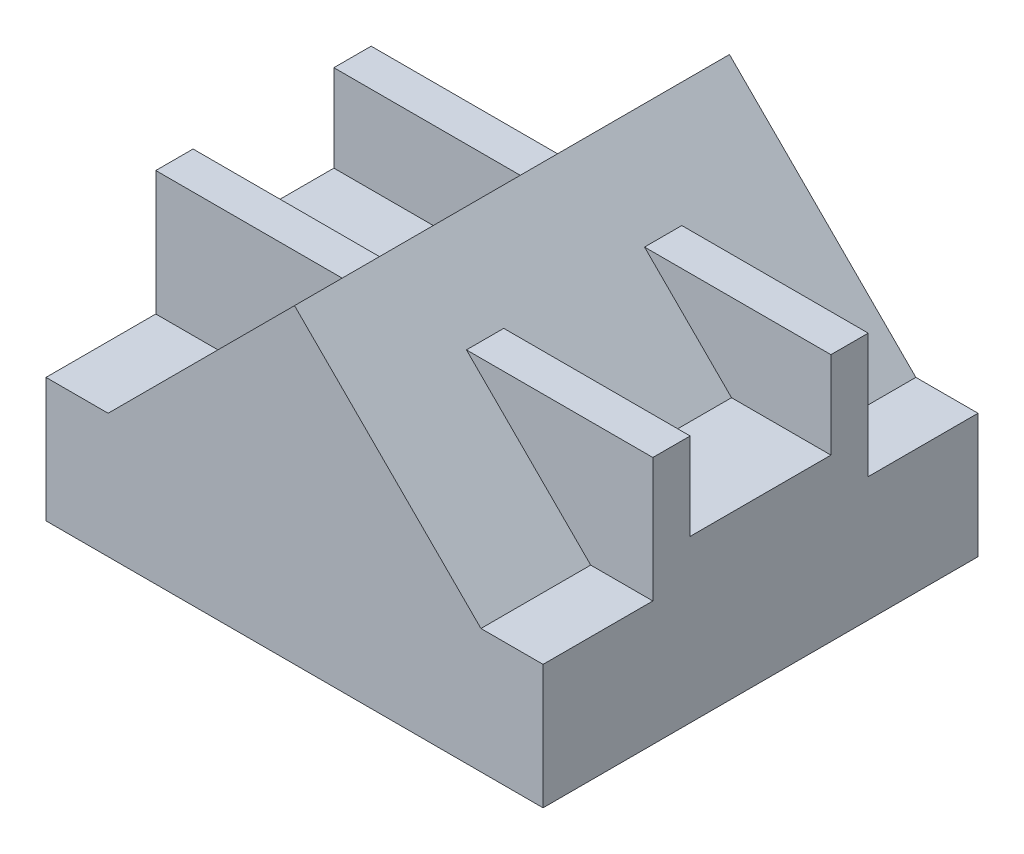
ISO-10303-21;
HEADER;
FILE_DESCRIPTION(('STEP AP214'),'2;1');
FILE_NAME('part.step','',(''),(''),'','','');
FILE_SCHEMA(('AUTOMOTIVE_DESIGN { 1 0 10303 214 1 1 1 1 }'));
ENDSEC;
DATA;
#1=APPLICATION_CONTEXT('core data for automotive mechanical design processes');
#2=APPLICATION_PROTOCOL_DEFINITION('international standard','automotive_design',2000,#1);
#3=PRODUCT_CONTEXT('',#1,'mechanical');
#4=PRODUCT('Part','Part','',(#3));
#5=PRODUCT_RELATED_PRODUCT_CATEGORY('part','',(#4));
#6=PRODUCT_DEFINITION_FORMATION('','',#4);
#7=PRODUCT_DEFINITION_CONTEXT('part definition',#1,'design');
#8=PRODUCT_DEFINITION('design','',#6,#7);
#9=PRODUCT_DEFINITION_SHAPE('','',#8);
#10=(LENGTH_UNIT() NAMED_UNIT(*) SI_UNIT(.MILLI.,.METRE.));
#11=(NAMED_UNIT(*) PLANE_ANGLE_UNIT() SI_UNIT($,.RADIAN.));
#12=(NAMED_UNIT(*) SI_UNIT($,.STERADIAN.) SOLID_ANGLE_UNIT());
#13=UNCERTAINTY_MEASURE_WITH_UNIT(LENGTH_MEASURE(1.E-05),#10,'distance_accuracy_value','');
#14=(GEOMETRIC_REPRESENTATION_CONTEXT(3) GLOBAL_UNCERTAINTY_ASSIGNED_CONTEXT((#13)) GLOBAL_UNIT_ASSIGNED_CONTEXT((#10,
#11,#12)) REPRESENTATION_CONTEXT('',''));
#15=CARTESIAN_POINT('',(0.,0.,0.));
#16=DIRECTION('',(0.,0.,1.));
#17=DIRECTION('',(1.,0.,0.));
#18=AXIS2_PLACEMENT_3D('',#15,#16,#17);
#19=CARTESIAN_POINT('',(0.,100.,-28.3278801642119));
#20=DIRECTION('',(0.,0.,1.));
#21=DIRECTION('',(1.,0.,0.));
#22=AXIS2_PLACEMENT_3D('',#19,#20,#21);
#23=PLANE('',#22);
#24=DIRECTION('',(-1.,0.,0.));
#25=VECTOR('',#24,1.);
#26=CARTESIAN_POINT('',(0.,65.,-28.3278801642119));
#27=LINE('',#26,#25);
#28=CARTESIAN_POINT('',(100.,65.,-28.3278801642119));
#29=VERTEX_POINT('',#28);
#30=CARTESIAN_POINT('',(60.,65.,-28.3278801642119));
#31=VERTEX_POINT('',#30);
#32=EDGE_CURVE('E319',#29,#31,#27,.T.);
#33=ORIENTED_EDGE('',*,*,#32,.F.);
#34=DIRECTION('',(0.,-1.,0.));
#35=VECTOR('',#34,1.);
#36=CARTESIAN_POINT('',(100.,100.,-28.3278801642119));
#37=LINE('',#36,#35);
#38=CARTESIAN_POINT('',(100.,100.,-28.3278801642119));
#39=VERTEX_POINT('',#38);
#40=EDGE_CURVE('E267',#39,#29,#37,.T.);
#41=ORIENTED_EDGE('',*,*,#40,.F.);
#42=DIRECTION('',(-1.,0.,0.));
#43=VECTOR('',#42,1.);
#44=CARTESIAN_POINT('',(0.,100.,-28.3278801642119));
#45=LINE('',#44,#43);
#46=CARTESIAN_POINT('',(25.,100.,-28.3278801642119));
#47=VERTEX_POINT('',#46);
#48=EDGE_CURVE('E249',#39,#47,#45,.T.);
#49=ORIENTED_EDGE('',*,*,#48,.T.);
#50=DIRECTION('',(-0.707106781186548,0.707106781186548,0.));
#51=VECTOR('',#50,1.);
#52=CARTESIAN_POINT('',(12.5,112.5,-28.3278801642119));
#53=LINE('',#52,#51);
#54=EDGE_CURVE('E215',#31,#47,#53,.T.);
#55=ORIENTED_EDGE('',*,*,#54,.F.);
#56=EDGE_LOOP('',(#33,#41,#49,#55));
#57=FACE_BOUND('',#56,.T.);
#58=ADVANCED_FACE('F43',(#57),#23,.T.);
#59=CARTESIAN_POINT('',(-60.,65.,-28.3278801642119));
#60=VERTEX_POINT('',#59);
#61=CARTESIAN_POINT('',(-100.,65.,-28.3278801642119));
#62=VERTEX_POINT('',#61);
#63=EDGE_CURVE('E317',#60,#62,#27,.T.);
#64=ORIENTED_EDGE('',*,*,#63,.F.);
#65=DIRECTION('',(-0.707106781186548,-0.707106781186548,0.));
#66=VECTOR('',#65,1.);
#67=CARTESIAN_POINT('',(-12.5,112.5,-28.3278801642119));
#68=LINE('',#67,#66);
#69=CARTESIAN_POINT('',(-25.,100.,-28.3278801642119));
#70=VERTEX_POINT('',#69);
#71=EDGE_CURVE('E238',#70,#60,#68,.T.);
#72=ORIENTED_EDGE('',*,*,#71,.F.);
#73=CARTESIAN_POINT('',(-100.,100.,-28.3278801642119));
#74=VERTEX_POINT('',#73);
#75=EDGE_CURVE('E248',#70,#74,#45,.T.);
#76=ORIENTED_EDGE('',*,*,#75,.T.);
#77=DIRECTION('',(0.,-1.,0.));
#78=VECTOR('',#77,1.);
#79=CARTESIAN_POINT('',(-100.,100.,-28.3278801642119));
#80=LINE('',#79,#78);
#81=EDGE_CURVE('E257',#74,#62,#80,.T.);
#82=ORIENTED_EDGE('',*,*,#81,.T.);
#83=EDGE_LOOP('',(#64,#72,#76,#82));
#84=FACE_BOUND('',#83,.T.);
#85=ADVANCED_FACE('F411',(#84),#23,.T.);
#86=CARTESIAN_POINT('',(-75.,50.,-87.5));
#87=DIRECTION('',(-0.707106781186547,0.707106781186547,0.));
#88=DIRECTION('',(-0.707106781186548,-0.707106781186548,0.));
#89=AXIS2_PLACEMENT_3D('',#86,#87,#88);
#90=PLANE('',#89);
#91=DIRECTION('',(0.707106781186548,0.707106781186548,0.));
#92=VECTOR('',#91,1.);
#93=CARTESIAN_POINT('',(-12.5,112.5,43.3278801642119));
#94=LINE('',#93,#92);
#95=CARTESIAN_POINT('',(-75.,50.,43.3278801642119));
#96=VERTEX_POINT('',#95);
#97=CARTESIAN_POINT('',(-25.,100.,43.3278801642119));
#98=VERTEX_POINT('',#97);
#99=EDGE_CURVE('E313',#96,#98,#94,.T.);
#100=ORIENTED_EDGE('',*,*,#99,.F.);
#101=DIRECTION('',(0.,0.,1.));
#102=VECTOR('',#101,1.);
#103=CARTESIAN_POINT('',(-75.,50.,-87.5));
#104=LINE('',#103,#102);
#105=CARTESIAN_POINT('',(-75.,50.,87.5));
#106=VERTEX_POINT('',#105);
#107=EDGE_CURVE('E230',#96,#106,#104,.T.);
#108=ORIENTED_EDGE('',*,*,#107,.T.);
#109=DIRECTION('',(-0.707106781186548,-0.707106781186548,0.));
#110=VECTOR('',#109,1.);
#111=CARTESIAN_POINT('',(-75.,50.,87.5));
#112=LINE('',#111,#110);
#113=CARTESIAN_POINT('',(0.,125.,87.5));
#114=VERTEX_POINT('',#113);
#115=EDGE_CURVE('E210',#114,#106,#112,.T.);
#116=ORIENTED_EDGE('',*,*,#115,.F.);
#117=DIRECTION('',(0.,0.,1.));
#118=VECTOR('',#117,1.);
#119=CARTESIAN_POINT('',(0.,125.,-87.5));
#120=LINE('',#119,#118);
#121=CARTESIAN_POINT('',(0.,125.,-87.5));
#122=VERTEX_POINT('',#121);
#123=EDGE_CURVE('E199',#122,#114,#120,.T.);
#124=ORIENTED_EDGE('',*,*,#123,.F.);
#125=DIRECTION('',(-0.707106781186548,-0.707106781186548,0.));
#126=VECTOR('',#125,1.);
#127=CARTESIAN_POINT('',(-75.,50.,-87.5));
#128=LINE('',#127,#126);
#129=CARTESIAN_POINT('',(-75.,50.,-87.5));
#130=VERTEX_POINT('',#129);
#131=EDGE_CURVE('E202',#122,#130,#128,.T.);
#132=ORIENTED_EDGE('',*,*,#131,.T.);
#133=CARTESIAN_POINT('',(-75.,50.,-43.3278801642119));
#134=VERTEX_POINT('',#133);
#135=EDGE_CURVE('E233',#130,#134,#104,.T.);
#136=ORIENTED_EDGE('',*,*,#135,.T.);
#137=DIRECTION('',(0.707106781186548,0.707106781186548,0.));
#138=VECTOR('',#137,1.);
#139=CARTESIAN_POINT('',(-12.5,112.5,-43.3278801642119));
#140=LINE('',#139,#138);
#141=CARTESIAN_POINT('',(-25.,100.,-43.3278801642119));
#142=VERTEX_POINT('',#141);
#143=EDGE_CURVE('E242',#134,#142,#140,.T.);
#144=ORIENTED_EDGE('',*,*,#143,.T.);
#145=DIRECTION('',(0.,0.,1.));
#146=VECTOR('',#145,1.);
#147=CARTESIAN_POINT('',(-25.,100.,0.));
#148=LINE('',#147,#146);
#149=EDGE_CURVE('E298',#142,#70,#148,.T.);
#150=ORIENTED_EDGE('',*,*,#149,.T.);
#151=ORIENTED_EDGE('',*,*,#71,.T.);
#152=DIRECTION('',(0.,0.,1.));
#153=VECTOR('',#152,1.);
#154=CARTESIAN_POINT('',(-60.,65.,0.));
#155=LINE('',#154,#153);
#156=CARTESIAN_POINT('',(-60.,65.,28.3278801642119));
#157=VERTEX_POINT('',#156);
#158=EDGE_CURVE('E11',#60,#157,#155,.T.);
#159=ORIENTED_EDGE('',*,*,#158,.T.);
#160=DIRECTION('',(-0.707106781186548,-0.707106781186548,0.));
#161=VECTOR('',#160,1.);
#162=CARTESIAN_POINT('',(-12.5,112.5,28.3278801642119));
#163=LINE('',#162,#161);
#164=CARTESIAN_POINT('',(-25.,100.,28.3278801642119));
#165=VERTEX_POINT('',#164);
#166=EDGE_CURVE('E308',#165,#157,#163,.T.);
#167=ORIENTED_EDGE('',*,*,#166,.F.);
#168=DIRECTION('',(0.,0.,1.));
#169=VECTOR('',#168,1.);
#170=CARTESIAN_POINT('',(-25.,100.,0.));
#171=LINE('',#170,#169);
#172=EDGE_CURVE('E306',#165,#98,#171,.T.);
#173=ORIENTED_EDGE('',*,*,#172,.T.);
#174=EDGE_LOOP('',(#100,#108,#116,#124,#132,#136,#144,#150,#151,#159,#167,#173));
#175=FACE_BOUND('',#174,.T.);
#176=ADVANCED_FACE('F201',(#175),#90,.T.);
#177=CARTESIAN_POINT('',(0.,125.,-87.5));
#178=DIRECTION('',(0.707106781186547,0.707106781186547,0.));
#179=DIRECTION('',(-0.707106781186548,0.707106781186548,0.));
#180=AXIS2_PLACEMENT_3D('',#177,#178,#179);
#181=PLANE('',#180);
#182=DIRECTION('',(0.707106781186548,-0.707106781186548,0.));
#183=VECTOR('',#182,1.);
#184=CARTESIAN_POINT('',(12.5,112.5,43.3278801642119));
#185=LINE('',#184,#183);
#186=CARTESIAN_POINT('',(25.,100.,43.3278801642119));
#187=VERTEX_POINT('',#186);
#188=CARTESIAN_POINT('',(75.,50.,43.3278801642119));
#189=VERTEX_POINT('',#188);
#190=EDGE_CURVE('E305',#187,#189,#185,.T.);
#191=ORIENTED_EDGE('',*,*,#190,.F.);
#192=DIRECTION('',(0.,0.,-1.));
#193=VECTOR('',#192,1.);
#194=CARTESIAN_POINT('',(25.,100.,0.));
#195=LINE('',#194,#193);
#196=CARTESIAN_POINT('',(25.,100.,28.3278801642119));
#197=VERTEX_POINT('',#196);
#198=EDGE_CURVE('E303',#187,#197,#195,.T.);
#199=ORIENTED_EDGE('',*,*,#198,.T.);
#200=DIRECTION('',(-0.707106781186548,0.707106781186548,0.));
#201=VECTOR('',#200,1.);
#202=CARTESIAN_POINT('',(12.5,112.5,28.3278801642119));
#203=LINE('',#202,#201);
#204=CARTESIAN_POINT('',(60.,65.,28.3278801642119));
#205=VERTEX_POINT('',#204);
#206=EDGE_CURVE('E300',#205,#197,#203,.T.);
#207=ORIENTED_EDGE('',*,*,#206,.F.);
#208=DIRECTION('',(0.,0.,-1.));
#209=VECTOR('',#208,1.);
#210=CARTESIAN_POINT('',(60.,65.,0.));
#211=LINE('',#210,#209);
#212=EDGE_CURVE('E51',#205,#31,#211,.T.);
#213=ORIENTED_EDGE('',*,*,#212,.T.);
#214=ORIENTED_EDGE('',*,*,#54,.T.);
#215=DIRECTION('',(0.,0.,-1.));
#216=VECTOR('',#215,1.);
#217=CARTESIAN_POINT('',(25.,100.,0.));
#218=LINE('',#217,#216);
#219=CARTESIAN_POINT('',(25.,100.,-43.3278801642119));
#220=VERTEX_POINT('',#219);
#221=EDGE_CURVE('E291',#47,#220,#218,.T.);
#222=ORIENTED_EDGE('',*,*,#221,.T.);
#223=DIRECTION('',(0.707106781186548,-0.707106781186548,0.));
#224=VECTOR('',#223,1.);
#225=CARTESIAN_POINT('',(12.5,112.5,-43.3278801642119));
#226=LINE('',#225,#224);
#227=CARTESIAN_POINT('',(75.,50.,-43.3278801642119));
#228=VERTEX_POINT('',#227);
#229=EDGE_CURVE('E236',#220,#228,#226,.T.);
#230=ORIENTED_EDGE('',*,*,#229,.T.);
#231=DIRECTION('',(0.,0.,1.));
#232=VECTOR('',#231,1.);
#233=CARTESIAN_POINT('',(75.,50.,-87.5));
#234=LINE('',#233,#232);
#235=CARTESIAN_POINT('',(75.,50.,-87.5));
#236=VERTEX_POINT('',#235);
#237=EDGE_CURVE('E213',#236,#228,#234,.T.);
#238=ORIENTED_EDGE('',*,*,#237,.F.);
#239=DIRECTION('',(-0.707106781186548,0.707106781186548,0.));
#240=VECTOR('',#239,1.);
#241=CARTESIAN_POINT('',(0.,125.,-87.5));
#242=LINE('',#241,#240);
#243=EDGE_CURVE('E219',#236,#122,#242,.T.);
#244=ORIENTED_EDGE('',*,*,#243,.T.);
#245=ORIENTED_EDGE('',*,*,#123,.T.);
#246=DIRECTION('',(-0.707106781186548,0.707106781186548,0.));
#247=VECTOR('',#246,1.);
#248=CARTESIAN_POINT('',(0.,125.,87.5));
#249=LINE('',#248,#247);
#250=CARTESIAN_POINT('',(75.,50.,87.5));
#251=VERTEX_POINT('',#250);
#252=EDGE_CURVE('E224',#251,#114,#249,.T.);
#253=ORIENTED_EDGE('',*,*,#252,.F.);
#254=EDGE_CURVE('E59',#189,#251,#234,.T.);
#255=ORIENTED_EDGE('',*,*,#254,.F.);
#256=EDGE_LOOP('',(#191,#199,#207,#213,#214,#222,#230,#238,#244,#245,#253,#255));
#257=FACE_BOUND('',#256,.T.);
#258=ADVANCED_FACE('F229',(#257),#181,.T.);
#259=CARTESIAN_POINT('',(0.,50.,0.));
#260=DIRECTION('',(0.,1.,0.));
#261=DIRECTION('',(0.,0.,1.));
#262=AXIS2_PLACEMENT_3D('',#259,#260,#261);
#263=PLANE('',#262);
#264=DIRECTION('',(1.,0.,0.));
#265=VECTOR('',#264,1.);
#266=CARTESIAN_POINT('',(0.,50.,-87.5));
#267=LINE('',#266,#265);
#268=CARTESIAN_POINT('',(100.,50.,-87.5));
#269=VERTEX_POINT('',#268);
#270=EDGE_CURVE('E278',#236,#269,#267,.T.);
#271=ORIENTED_EDGE('',*,*,#270,.F.);
#272=ORIENTED_EDGE('',*,*,#237,.T.);
#273=DIRECTION('',(1.,0.,0.));
#274=VECTOR('',#273,1.);
#275=CARTESIAN_POINT('',(0.,50.,-43.3278801642119));
#276=LINE('',#275,#274);
#277=CARTESIAN_POINT('',(100.,50.,-43.3278801642119));
#278=VERTEX_POINT('',#277);
#279=EDGE_CURVE('E280',#228,#278,#276,.T.);
#280=ORIENTED_EDGE('',*,*,#279,.T.);
#281=DIRECTION('',(0.,0.,-1.));
#282=VECTOR('',#281,1.);
#283=CARTESIAN_POINT('',(100.,50.,0.));
#284=LINE('',#283,#282);
#285=EDGE_CURVE('E277',#278,#269,#284,.T.);
#286=ORIENTED_EDGE('',*,*,#285,.T.);
#287=EDGE_LOOP('',(#271,#272,#280,#286));
#288=FACE_BOUND('',#287,.T.);
#289=ADVANCED_FACE('F394',(#288),#263,.T.);
#290=CARTESIAN_POINT('',(0.,100.,-43.3278801642119));
#291=DIRECTION('',(0.,0.,-1.));
#292=DIRECTION('',(-1.,0.,0.));
#293=AXIS2_PLACEMENT_3D('',#290,#291,#292);
#294=PLANE('',#293);
#295=ORIENTED_EDGE('',*,*,#143,.F.);
#296=CARTESIAN_POINT('',(-100.,50.,-43.3278801642119));
#297=VERTEX_POINT('',#296);
#298=EDGE_CURVE('E272',#297,#134,#276,.T.);
#299=ORIENTED_EDGE('',*,*,#298,.F.);
#300=DIRECTION('',(0.,-1.,0.));
#301=VECTOR('',#300,1.);
#302=CARTESIAN_POINT('',(-100.,100.,-43.3278801642119));
#303=LINE('',#302,#301);
#304=CARTESIAN_POINT('',(-100.,100.,-43.3278801642119));
#305=VERTEX_POINT('',#304);
#306=EDGE_CURVE('E263',#305,#297,#303,.T.);
#307=ORIENTED_EDGE('',*,*,#306,.F.);
#308=DIRECTION('',(1.,0.,0.));
#309=VECTOR('',#308,1.);
#310=CARTESIAN_POINT('',(0.,100.,-43.3278801642119));
#311=LINE('',#310,#309);
#312=EDGE_CURVE('E255',#305,#142,#311,.T.);
#313=ORIENTED_EDGE('',*,*,#312,.T.);
#314=EDGE_LOOP('',(#295,#299,#307,#313));
#315=FACE_BOUND('',#314,.T.);
#316=ADVANCED_FACE('F403',(#315),#294,.T.);
#317=CARTESIAN_POINT('',(0.,100.,0.));
#318=DIRECTION('',(0.,1.,0.));
#319=DIRECTION('',(0.,0.,1.));
#320=AXIS2_PLACEMENT_3D('',#317,#318,#319);
#321=PLANE('',#320);
#322=ORIENTED_EDGE('',*,*,#149,.F.);
#323=ORIENTED_EDGE('',*,*,#312,.F.);
#324=DIRECTION('',(0.,0.,-1.));
#325=VECTOR('',#324,1.);
#326=CARTESIAN_POINT('',(-100.,100.,0.));
#327=LINE('',#326,#325);
#328=EDGE_CURVE('E260',#74,#305,#327,.T.);
#329=ORIENTED_EDGE('',*,*,#328,.F.);
#330=ORIENTED_EDGE('',*,*,#75,.F.);
#331=EDGE_LOOP('',(#322,#323,#329,#330));
#332=FACE_BOUND('',#331,.T.);
#333=ADVANCED_FACE('F410',(#332),#321,.T.);
#334=CARTESIAN_POINT('',(0.,50.,-87.5));
#335=DIRECTION('',(0.,0.,-1.));
#336=DIRECTION('',(-1.,0.,0.));
#337=AXIS2_PLACEMENT_3D('',#334,#335,#336);
#338=PLANE('',#337);
#339=DIRECTION('',(1.,0.,0.));
#340=VECTOR('',#339,1.);
#341=CARTESIAN_POINT('',(0.,0.,-87.5));
#342=LINE('',#341,#340);
#343=CARTESIAN_POINT('',(-100.,0.,-87.5));
#344=VERTEX_POINT('',#343);
#345=CARTESIAN_POINT('',(100.,0.,-87.5));
#346=VERTEX_POINT('',#345);
#347=EDGE_CURVE('E275',#344,#346,#342,.T.);
#348=ORIENTED_EDGE('',*,*,#347,.F.);
#349=DIRECTION('',(0.,-1.,0.));
#350=VECTOR('',#349,1.);
#351=CARTESIAN_POINT('',(-100.,50.,-87.5));
#352=LINE('',#351,#350);
#353=CARTESIAN_POINT('',(-100.,50.,-87.5));
#354=VERTEX_POINT('',#353);
#355=EDGE_CURVE('E281',#354,#344,#352,.T.);
#356=ORIENTED_EDGE('',*,*,#355,.F.);
#357=EDGE_CURVE('E225',#354,#130,#267,.T.);
#358=ORIENTED_EDGE('',*,*,#357,.T.);
#359=ORIENTED_EDGE('',*,*,#131,.F.);
#360=ORIENTED_EDGE('',*,*,#243,.F.);
#361=ORIENTED_EDGE('',*,*,#270,.T.);
#362=DIRECTION('',(0.,-1.,0.));
#363=VECTOR('',#362,1.);
#364=CARTESIAN_POINT('',(100.,50.,-87.5));
#365=LINE('',#364,#363);
#366=EDGE_CURVE('E286',#269,#346,#365,.T.);
#367=ORIENTED_EDGE('',*,*,#366,.T.);
#368=EDGE_LOOP('',(#348,#356,#358,#359,#360,#361,#367));
#369=FACE_BOUND('',#368,.T.);
#370=ADVANCED_FACE('F218',(#369),#338,.T.);
#371=ORIENTED_EDGE('',*,*,#135,.F.);
#372=ORIENTED_EDGE('',*,*,#357,.F.);
#373=DIRECTION('',(0.,0.,-1.));
#374=VECTOR('',#373,1.);
#375=CARTESIAN_POINT('',(-100.,50.,0.));
#376=LINE('',#375,#374);
#377=EDGE_CURVE('E284',#297,#354,#376,.T.);
#378=ORIENTED_EDGE('',*,*,#377,.F.);
#379=ORIENTED_EDGE('',*,*,#298,.T.);
#380=EDGE_LOOP('',(#371,#372,#378,#379));
#381=FACE_BOUND('',#380,.T.);
#382=ADVANCED_FACE('F401',(#381),#263,.T.);
#383=ORIENTED_EDGE('',*,*,#229,.F.);
#384=CARTESIAN_POINT('',(100.,100.,-43.3278801642119));
#385=VERTEX_POINT('',#384);
#386=EDGE_CURVE('E251',#220,#385,#311,.T.);
#387=ORIENTED_EDGE('',*,*,#386,.T.);
#388=DIRECTION('',(0.,-1.,0.));
#389=VECTOR('',#388,1.);
#390=CARTESIAN_POINT('',(100.,100.,-43.3278801642119));
#391=LINE('',#390,#389);
#392=EDGE_CURVE('E266',#385,#278,#391,.T.);
#393=ORIENTED_EDGE('',*,*,#392,.T.);
#394=ORIENTED_EDGE('',*,*,#279,.F.);
#395=EDGE_LOOP('',(#383,#387,#393,#394));
#396=FACE_BOUND('',#395,.T.);
#397=ADVANCED_FACE('F386',(#396),#294,.T.);
#398=ORIENTED_EDGE('',*,*,#221,.F.);
#399=ORIENTED_EDGE('',*,*,#48,.F.);
#400=DIRECTION('',(0.,0.,-1.));
#401=VECTOR('',#400,1.);
#402=CARTESIAN_POINT('',(100.,100.,0.));
#403=LINE('',#402,#401);
#404=EDGE_CURVE('E246',#39,#385,#403,.T.);
#405=ORIENTED_EDGE('',*,*,#404,.T.);
#406=ORIENTED_EDGE('',*,*,#386,.F.);
#407=EDGE_LOOP('',(#398,#399,#405,#406));
#408=FACE_BOUND('',#407,.T.);
#409=ADVANCED_FACE('F383',(#408),#321,.T.);
#410=CARTESIAN_POINT('',(0.,50.,0.));
#411=DIRECTION('',(0.,1.,0.));
#412=DIRECTION('',(0.,0.,1.));
#413=AXIS2_PLACEMENT_3D('',#410,#411,#412);
#414=PLANE('',#413);
#415=DIRECTION('',(1.,0.,0.));
#416=VECTOR('',#415,1.);
#417=CARTESIAN_POINT('',(0.,50.,43.3278801642119));
#418=LINE('',#417,#416);
#419=CARTESIAN_POINT('',(100.,50.,43.3278801642119));
#420=VERTEX_POINT('',#419);
#421=EDGE_CURVE('E358',#189,#420,#418,.T.);
#422=ORIENTED_EDGE('',*,*,#421,.F.);
#423=ORIENTED_EDGE('',*,*,#254,.T.);
#424=DIRECTION('',(1.,0.,0.));
#425=VECTOR('',#424,1.);
#426=CARTESIAN_POINT('',(0.,50.,87.5));
#427=LINE('',#426,#425);
#428=CARTESIAN_POINT('',(100.,50.,87.5));
#429=VERTEX_POINT('',#428);
#430=EDGE_CURVE('E360',#251,#429,#427,.T.);
#431=ORIENTED_EDGE('',*,*,#430,.T.);
#432=DIRECTION('',(0.,0.,-1.));
#433=VECTOR('',#432,1.);
#434=CARTESIAN_POINT('',(100.,50.,0.));
#435=LINE('',#434,#433);
#436=EDGE_CURVE('E363',#429,#420,#435,.T.);
#437=ORIENTED_EDGE('',*,*,#436,.T.);
#438=EDGE_LOOP('',(#422,#423,#431,#437));
#439=FACE_BOUND('',#438,.T.);
#440=ADVANCED_FACE('F437',(#439),#414,.T.);
#441=CARTESIAN_POINT('',(0.,100.,43.3278801642119));
#442=DIRECTION('',(0.,0.,-1.));
#443=DIRECTION('',(-1.,0.,0.));
#444=AXIS2_PLACEMENT_3D('',#441,#442,#443);
#445=PLANE('',#444);
#446=CARTESIAN_POINT('',(-100.,50.,43.3278801642119));
#447=VERTEX_POINT('',#446);
#448=EDGE_CURVE('E354',#447,#96,#418,.T.);
#449=ORIENTED_EDGE('',*,*,#448,.T.);
#450=ORIENTED_EDGE('',*,*,#99,.T.);
#451=DIRECTION('',(1.,0.,0.));
#452=VECTOR('',#451,1.);
#453=CARTESIAN_POINT('',(0.,100.,43.3278801642119));
#454=LINE('',#453,#452);
#455=CARTESIAN_POINT('',(-100.,100.,43.3278801642119));
#456=VERTEX_POINT('',#455);
#457=EDGE_CURVE('E338',#456,#98,#454,.T.);
#458=ORIENTED_EDGE('',*,*,#457,.F.);
#459=DIRECTION('',(0.,-1.,0.));
#460=VECTOR('',#459,1.);
#461=CARTESIAN_POINT('',(-100.,100.,43.3278801642119));
#462=LINE('',#461,#460);
#463=EDGE_CURVE('E344',#456,#447,#462,.T.);
#464=ORIENTED_EDGE('',*,*,#463,.T.);
#465=EDGE_LOOP('',(#449,#450,#458,#464));
#466=FACE_BOUND('',#465,.T.);
#467=ADVANCED_FACE('F427',(#466),#445,.F.);
#468=CARTESIAN_POINT('',(0.,100.,28.3278801642119));
#469=DIRECTION('',(0.,0.,1.));
#470=DIRECTION('',(1.,0.,0.));
#471=AXIS2_PLACEMENT_3D('',#468,#469,#470);
#472=PLANE('',#471);
#473=DIRECTION('',(-1.,0.,0.));
#474=VECTOR('',#473,1.);
#475=CARTESIAN_POINT('',(0.,100.,28.3278801642119));
#476=LINE('',#475,#474);
#477=CARTESIAN_POINT('',(-100.,100.,28.3278801642119));
#478=VERTEX_POINT('',#477);
#479=EDGE_CURVE('E327',#165,#478,#476,.T.);
#480=ORIENTED_EDGE('',*,*,#479,.F.);
#481=ORIENTED_EDGE('',*,*,#166,.T.);
#482=DIRECTION('',(-1.,0.,0.));
#483=VECTOR('',#482,1.);
#484=CARTESIAN_POINT('',(0.,65.,28.3278801642119));
#485=LINE('',#484,#483);
#486=CARTESIAN_POINT('',(-100.,65.,28.3278801642119));
#487=VERTEX_POINT('',#486);
#488=EDGE_CURVE('E311',#157,#487,#485,.T.);
#489=ORIENTED_EDGE('',*,*,#488,.T.);
#490=DIRECTION('',(0.,-1.,0.));
#491=VECTOR('',#490,1.);
#492=CARTESIAN_POINT('',(-100.,100.,28.3278801642119));
#493=LINE('',#492,#491);
#494=EDGE_CURVE('E341',#478,#487,#493,.T.);
#495=ORIENTED_EDGE('',*,*,#494,.F.);
#496=EDGE_LOOP('',(#480,#481,#489,#495));
#497=FACE_BOUND('',#496,.T.);
#498=ADVANCED_FACE('F421',(#497),#472,.F.);
#499=CARTESIAN_POINT('',(0.,100.,0.));
#500=DIRECTION('',(0.,1.,0.));
#501=DIRECTION('',(0.,0.,1.));
#502=AXIS2_PLACEMENT_3D('',#499,#500,#501);
#503=PLANE('',#502);
#504=ORIENTED_EDGE('',*,*,#172,.F.);
#505=ORIENTED_EDGE('',*,*,#479,.T.);
#506=DIRECTION('',(0.,0.,-1.));
#507=VECTOR('',#506,1.);
#508=CARTESIAN_POINT('',(-100.,100.,0.));
#509=LINE('',#508,#507);
#510=EDGE_CURVE('E335',#456,#478,#509,.T.);
#511=ORIENTED_EDGE('',*,*,#510,.F.);
#512=ORIENTED_EDGE('',*,*,#457,.T.);
#513=EDGE_LOOP('',(#504,#505,#511,#512));
#514=FACE_BOUND('',#513,.T.);
#515=ADVANCED_FACE('F426',(#514),#503,.T.);
#516=CARTESIAN_POINT('',(0.,65.,0.));
#517=DIRECTION('',(0.,1.,0.));
#518=DIRECTION('',(0.,0.,1.));
#519=AXIS2_PLACEMENT_3D('',#516,#517,#518);
#520=PLANE('',#519);
#521=ORIENTED_EDGE('',*,*,#158,.F.);
#522=ORIENTED_EDGE('',*,*,#63,.T.);
#523=DIRECTION('',(0.,0.,-1.));
#524=VECTOR('',#523,1.);
#525=CARTESIAN_POINT('',(-100.,65.,0.));
#526=LINE('',#525,#524);
#527=EDGE_CURVE('E325',#487,#62,#526,.T.);
#528=ORIENTED_EDGE('',*,*,#527,.F.);
#529=ORIENTED_EDGE('',*,*,#488,.F.);
#530=EDGE_LOOP('',(#521,#522,#528,#529));
#531=FACE_BOUND('',#530,.T.);
#532=ADVANCED_FACE('F420',(#531),#520,.T.);
#533=CARTESIAN_POINT('',(-100.,50.,0.));
#534=DIRECTION('',(-1.,0.,0.));
#535=DIRECTION('',(0.,0.,1.));
#536=AXIS2_PLACEMENT_3D('',#533,#534,#535);
#537=PLANE('',#536);
#538=DIRECTION('',(0.,0.,-1.));
#539=VECTOR('',#538,1.);
#540=CARTESIAN_POINT('',(-100.,0.,0.));
#541=LINE('',#540,#539);
#542=CARTESIAN_POINT('',(-100.,0.,87.5));
#543=VERTEX_POINT('',#542);
#544=EDGE_CURVE('E353',#543,#344,#541,.T.);
#545=ORIENTED_EDGE('',*,*,#544,.F.);
#546=DIRECTION('',(0.,-1.,0.));
#547=VECTOR('',#546,1.);
#548=CARTESIAN_POINT('',(-100.,50.,87.5));
#549=LINE('',#548,#547);
#550=CARTESIAN_POINT('',(-100.,50.,87.5));
#551=VERTEX_POINT('',#550);
#552=EDGE_CURVE('E375',#551,#543,#549,.T.);
#553=ORIENTED_EDGE('',*,*,#552,.F.);
#554=DIRECTION('',(0.,0.,-1.));
#555=VECTOR('',#554,1.);
#556=CARTESIAN_POINT('',(-100.,50.,0.));
#557=LINE('',#556,#555);
#558=EDGE_CURVE('E351',#551,#447,#557,.T.);
#559=ORIENTED_EDGE('',*,*,#558,.T.);
#560=ORIENTED_EDGE('',*,*,#463,.F.);
#561=ORIENTED_EDGE('',*,*,#510,.T.);
#562=ORIENTED_EDGE('',*,*,#494,.T.);
#563=ORIENTED_EDGE('',*,*,#527,.T.);
#564=ORIENTED_EDGE('',*,*,#81,.F.);
#565=ORIENTED_EDGE('',*,*,#328,.T.);
#566=ORIENTED_EDGE('',*,*,#306,.T.);
#567=ORIENTED_EDGE('',*,*,#377,.T.);
#568=ORIENTED_EDGE('',*,*,#355,.T.);
#569=EDGE_LOOP('',(#545,#553,#559,#560,#561,#562,#563,#564,#565,#566,#567,#568));
#570=FACE_BOUND('',#569,.T.);
#571=ADVANCED_FACE('F44',(#570),#537,.T.);
#572=CARTESIAN_POINT('',(0.,50.,87.5));
#573=DIRECTION('',(0.,0.,-1.));
#574=DIRECTION('',(-1.,0.,0.));
#575=AXIS2_PLACEMENT_3D('',#572,#573,#574);
#576=PLANE('',#575);
#577=DIRECTION('',(1.,0.,0.));
#578=VECTOR('',#577,1.);
#579=CARTESIAN_POINT('',(0.,0.,87.5));
#580=LINE('',#579,#578);
#581=CARTESIAN_POINT('',(100.,0.,87.5));
#582=VERTEX_POINT('',#581);
#583=EDGE_CURVE('E368',#543,#582,#580,.T.);
#584=ORIENTED_EDGE('',*,*,#583,.T.);
#585=DIRECTION('',(0.,-1.,0.));
#586=VECTOR('',#585,1.);
#587=CARTESIAN_POINT('',(100.,50.,87.5));
#588=LINE('',#587,#586);
#589=EDGE_CURVE('E365',#429,#582,#588,.T.);
#590=ORIENTED_EDGE('',*,*,#589,.F.);
#591=ORIENTED_EDGE('',*,*,#430,.F.);
#592=ORIENTED_EDGE('',*,*,#252,.T.);
#593=ORIENTED_EDGE('',*,*,#115,.T.);
#594=EDGE_CURVE('E68',#551,#106,#427,.T.);
#595=ORIENTED_EDGE('',*,*,#594,.F.);
#596=ORIENTED_EDGE('',*,*,#552,.T.);
#597=EDGE_LOOP('',(#584,#590,#591,#592,#593,#595,#596));
#598=FACE_BOUND('',#597,.T.);
#599=ADVANCED_FACE('F435',(#598),#576,.F.);
#600=CARTESIAN_POINT('',(100.,50.,0.));
#601=DIRECTION('',(-1.,0.,0.));
#602=DIRECTION('',(0.,0.,1.));
#603=AXIS2_PLACEMENT_3D('',#600,#601,#602);
#604=PLANE('',#603);
#605=DIRECTION('',(0.,0.,-1.));
#606=VECTOR('',#605,1.);
#607=CARTESIAN_POINT('',(100.,0.,0.));
#608=LINE('',#607,#606);
#609=EDGE_CURVE('E366',#582,#346,#608,.T.);
#610=ORIENTED_EDGE('',*,*,#609,.T.);
#611=ORIENTED_EDGE('',*,*,#366,.F.);
#612=ORIENTED_EDGE('',*,*,#285,.F.);
#613=ORIENTED_EDGE('',*,*,#392,.F.);
#614=ORIENTED_EDGE('',*,*,#404,.F.);
#615=ORIENTED_EDGE('',*,*,#40,.T.);
#616=DIRECTION('',(0.,0.,-1.));
#617=VECTOR('',#616,1.);
#618=CARTESIAN_POINT('',(100.,65.,0.));
#619=LINE('',#618,#617);
#620=CARTESIAN_POINT('',(100.,65.,28.3278801642119));
#621=VERTEX_POINT('',#620);
#622=EDGE_CURVE('E320',#621,#29,#619,.T.);
#623=ORIENTED_EDGE('',*,*,#622,.F.);
#624=DIRECTION('',(0.,-1.,0.));
#625=VECTOR('',#624,1.);
#626=CARTESIAN_POINT('',(100.,100.,28.3278801642119));
#627=LINE('',#626,#625);
#628=CARTESIAN_POINT('',(100.,100.,28.3278801642119));
#629=VERTEX_POINT('',#628);
#630=EDGE_CURVE('E346',#629,#621,#627,.T.);
#631=ORIENTED_EDGE('',*,*,#630,.F.);
#632=DIRECTION('',(0.,0.,-1.));
#633=VECTOR('',#632,1.);
#634=CARTESIAN_POINT('',(100.,100.,0.));
#635=LINE('',#634,#633);
#636=CARTESIAN_POINT('',(100.,100.,43.3278801642119));
#637=VERTEX_POINT('',#636);
#638=EDGE_CURVE('E324',#637,#629,#635,.T.);
#639=ORIENTED_EDGE('',*,*,#638,.F.);
#640=DIRECTION('',(0.,-1.,0.));
#641=VECTOR('',#640,1.);
#642=CARTESIAN_POINT('',(100.,100.,43.3278801642119));
#643=LINE('',#642,#641);
#644=EDGE_CURVE('E340',#637,#420,#643,.T.);
#645=ORIENTED_EDGE('',*,*,#644,.T.);
#646=ORIENTED_EDGE('',*,*,#436,.F.);
#647=ORIENTED_EDGE('',*,*,#589,.T.);
#648=EDGE_LOOP('',(#610,#611,#612,#613,#614,#615,#623,#631,#639,#645,#646,#647));
#649=FACE_BOUND('',#648,.T.);
#650=ADVANCED_FACE('F442',(#649),#604,.F.);
#651=ORIENTED_EDGE('',*,*,#107,.F.);
#652=ORIENTED_EDGE('',*,*,#448,.F.);
#653=ORIENTED_EDGE('',*,*,#558,.F.);
#654=ORIENTED_EDGE('',*,*,#594,.T.);
#655=EDGE_LOOP('',(#651,#652,#653,#654));
#656=FACE_BOUND('',#655,.T.);
#657=ADVANCED_FACE('F429',(#656),#414,.T.);
#658=CARTESIAN_POINT('',(0.,0.,0.));
#659=DIRECTION('',(0.,1.,0.));
#660=DIRECTION('',(0.,0.,1.));
#661=AXIS2_PLACEMENT_3D('',#658,#659,#660);
#662=PLANE('',#661);
#663=ORIENTED_EDGE('',*,*,#544,.T.);
#664=ORIENTED_EDGE('',*,*,#347,.T.);
#665=ORIENTED_EDGE('',*,*,#609,.F.);
#666=ORIENTED_EDGE('',*,*,#583,.F.);
#667=EDGE_LOOP('',(#663,#664,#665,#666));
#668=FACE_BOUND('',#667,.T.);
#669=ADVANCED_FACE('F399',(#668),#662,.F.);
#670=EDGE_CURVE('E333',#187,#637,#454,.T.);
#671=ORIENTED_EDGE('',*,*,#670,.F.);
#672=ORIENTED_EDGE('',*,*,#190,.T.);
#673=ORIENTED_EDGE('',*,*,#421,.T.);
#674=ORIENTED_EDGE('',*,*,#644,.F.);
#675=EDGE_LOOP('',(#671,#672,#673,#674));
#676=FACE_BOUND('',#675,.T.);
#677=ADVANCED_FACE('F436',(#676),#445,.F.);
#678=EDGE_CURVE('E314',#621,#205,#485,.T.);
#679=ORIENTED_EDGE('',*,*,#678,.T.);
#680=ORIENTED_EDGE('',*,*,#206,.T.);
#681=EDGE_CURVE('E328',#629,#197,#476,.T.);
#682=ORIENTED_EDGE('',*,*,#681,.F.);
#683=ORIENTED_EDGE('',*,*,#630,.T.);
#684=EDGE_LOOP('',(#679,#680,#682,#683));
#685=FACE_BOUND('',#684,.T.);
#686=ADVANCED_FACE('F448',(#685),#472,.F.);
#687=ORIENTED_EDGE('',*,*,#198,.F.);
#688=ORIENTED_EDGE('',*,*,#670,.T.);
#689=ORIENTED_EDGE('',*,*,#638,.T.);
#690=ORIENTED_EDGE('',*,*,#681,.T.);
#691=EDGE_LOOP('',(#687,#688,#689,#690));
#692=FACE_BOUND('',#691,.T.);
#693=ADVANCED_FACE('F441',(#692),#503,.T.);
#694=ORIENTED_EDGE('',*,*,#212,.F.);
#695=ORIENTED_EDGE('',*,*,#678,.F.);
#696=ORIENTED_EDGE('',*,*,#622,.T.);
#697=ORIENTED_EDGE('',*,*,#32,.T.);
#698=EDGE_LOOP('',(#694,#695,#696,#697));
#699=FACE_BOUND('',#698,.T.);
#700=ADVANCED_FACE('F449',(#699),#520,.T.);
#701=CLOSED_SHELL('',(#58,#85,#176,#258,#289,#316,#333,#370,#382,#397,#409,#440,#467,#498,#515,
#532,#571,#599,#650,#657,#669,#677,#686,#693,#700));
#702=MANIFOLD_SOLID_BREP('B2',#701);
#703=ADVANCED_BREP_SHAPE_REPRESENTATION('',(#18,#702),#14);
#704=SHAPE_DEFINITION_REPRESENTATION(#9,#703);
ENDSEC;
END-ISO-10303-21;
